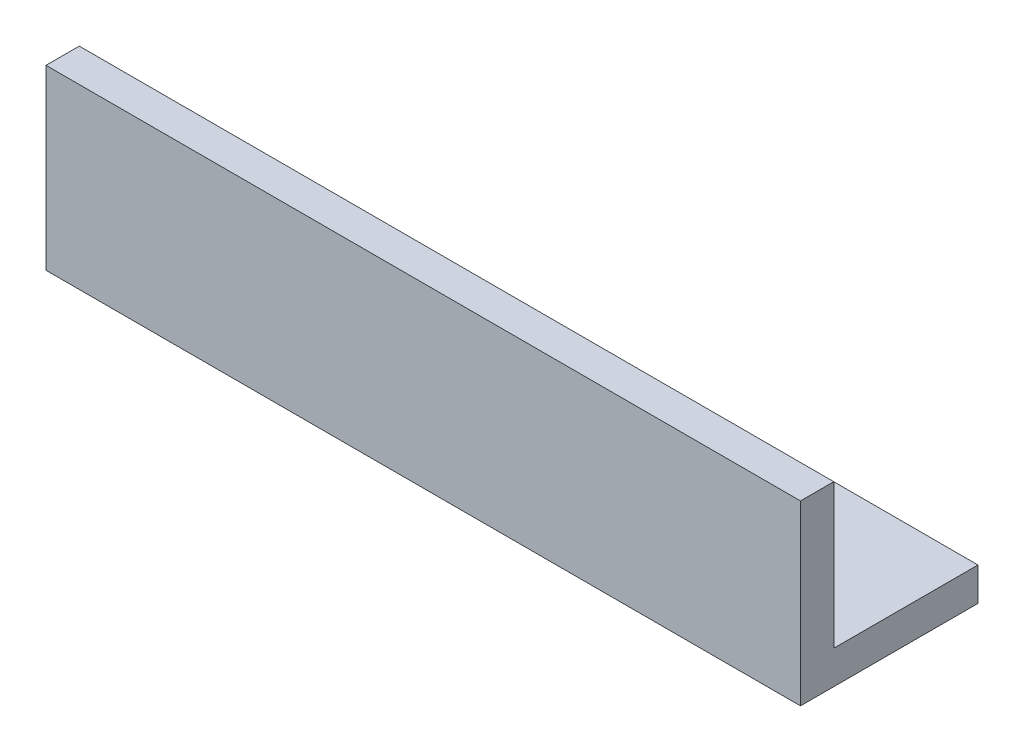
ISO-10303-21;
HEADER;
FILE_DESCRIPTION(('STEP AP214'),'2;1');
FILE_NAME('part.step','',(''),(''),'','','');
FILE_SCHEMA(('AUTOMOTIVE_DESIGN { 1 0 10303 214 1 1 1 1 }'));
ENDSEC;
DATA;
#1=APPLICATION_CONTEXT('core data for automotive mechanical design processes');
#2=APPLICATION_PROTOCOL_DEFINITION('international standard','automotive_design',2000,#1);
#3=PRODUCT_CONTEXT('',#1,'mechanical');
#4=PRODUCT('Part','Part','',(#3));
#5=PRODUCT_RELATED_PRODUCT_CATEGORY('part','',(#4));
#6=PRODUCT_DEFINITION_FORMATION('','',#4);
#7=PRODUCT_DEFINITION_CONTEXT('part definition',#1,'design');
#8=PRODUCT_DEFINITION('design','',#6,#7);
#9=PRODUCT_DEFINITION_SHAPE('','',#8);
#10=(LENGTH_UNIT() NAMED_UNIT(*) SI_UNIT(.MILLI.,.METRE.));
#11=(NAMED_UNIT(*) PLANE_ANGLE_UNIT() SI_UNIT($,.RADIAN.));
#12=(NAMED_UNIT(*) SI_UNIT($,.STERADIAN.) SOLID_ANGLE_UNIT());
#13=UNCERTAINTY_MEASURE_WITH_UNIT(LENGTH_MEASURE(1.E-05),#10,'distance_accuracy_value','');
#14=(GEOMETRIC_REPRESENTATION_CONTEXT(3) GLOBAL_UNCERTAINTY_ASSIGNED_CONTEXT((#13)) GLOBAL_UNIT_ASSIGNED_CONTEXT((#10,
#11,#12)) REPRESENTATION_CONTEXT('',''));
#15=CARTESIAN_POINT('',(0.,0.,0.));
#16=DIRECTION('',(0.,0.,1.));
#17=DIRECTION('',(1.,0.,0.));
#18=AXIS2_PLACEMENT_3D('',#15,#16,#17);
#19=CARTESIAN_POINT('',(107.95,0.,-4.7625));
#20=DIRECTION('',(0.,-1.,0.));
#21=DIRECTION('',(0.,0.,-1.));
#22=AXIS2_PLACEMENT_3D('',#19,#20,#21);
#23=PLANE('',#22);
#24=DIRECTION('',(0.,0.,1.));
#25=VECTOR('',#24,1.);
#26=CARTESIAN_POINT('',(0.,0.,-4.7625));
#27=LINE('',#26,#25);
#28=CARTESIAN_POINT('',(0.,0.,-4.7625));
#29=VERTEX_POINT('',#28);
#30=CARTESIAN_POINT('',(0.,0.,0.));
#31=VERTEX_POINT('',#30);
#32=EDGE_CURVE('E117',#29,#31,#27,.T.);
#33=ORIENTED_EDGE('',*,*,#32,.T.);
#34=DIRECTION('',(-1.,0.,0.));
#35=VECTOR('',#34,1.);
#36=CARTESIAN_POINT('',(107.95,0.,0.));
#37=LINE('',#36,#35);
#38=CARTESIAN_POINT('',(107.95,0.,0.));
#39=VERTEX_POINT('',#38);
#40=EDGE_CURVE('E11',#39,#31,#37,.T.);
#41=ORIENTED_EDGE('',*,*,#40,.F.);
#42=DIRECTION('',(0.,0.,1.));
#43=VECTOR('',#42,1.);
#44=CARTESIAN_POINT('',(107.95,0.,-4.7625));
#45=LINE('',#44,#43);
#46=CARTESIAN_POINT('',(107.95,0.,-4.7625));
#47=VERTEX_POINT('',#46);
#48=EDGE_CURVE('E128',#47,#39,#45,.T.);
#49=ORIENTED_EDGE('',*,*,#48,.F.);
#50=DIRECTION('',(-1.,0.,0.));
#51=VECTOR('',#50,1.);
#52=CARTESIAN_POINT('',(107.95,0.,-4.7625));
#53=LINE('',#52,#51);
#54=EDGE_CURVE('E113',#47,#29,#53,.T.);
#55=ORIENTED_EDGE('',*,*,#54,.T.);
#56=EDGE_LOOP('',(#33,#41,#49,#55));
#57=FACE_BOUND('',#56,.T.);
#58=ADVANCED_FACE('F33',(#57),#23,.F.);
#59=CARTESIAN_POINT('',(107.95,0.,0.));
#60=DIRECTION('',(0.,0.,-1.));
#61=DIRECTION('',(0.,1.,0.));
#62=AXIS2_PLACEMENT_3D('',#59,#60,#61);
#63=PLANE('',#62);
#64=DIRECTION('',(0.,-1.,0.));
#65=VECTOR('',#64,1.);
#66=CARTESIAN_POINT('',(0.,0.,0.));
#67=LINE('',#66,#65);
#68=CARTESIAN_POINT('',(0.,-25.4,0.));
#69=VERTEX_POINT('',#68);
#70=EDGE_CURVE('E120',#31,#69,#67,.T.);
#71=ORIENTED_EDGE('',*,*,#70,.T.);
#72=DIRECTION('',(-1.,0.,0.));
#73=VECTOR('',#72,1.);
#74=CARTESIAN_POINT('',(107.95,-25.4,0.));
#75=LINE('',#74,#73);
#76=CARTESIAN_POINT('',(107.95,-25.4,0.));
#77=VERTEX_POINT('',#76);
#78=EDGE_CURVE('E41',#77,#69,#75,.T.);
#79=ORIENTED_EDGE('',*,*,#78,.F.);
#80=DIRECTION('',(0.,-1.,0.));
#81=VECTOR('',#80,1.);
#82=CARTESIAN_POINT('',(107.95,0.,0.));
#83=LINE('',#82,#81);
#84=EDGE_CURVE('E86',#39,#77,#83,.T.);
#85=ORIENTED_EDGE('',*,*,#84,.F.);
#86=ORIENTED_EDGE('',*,*,#40,.T.);
#87=EDGE_LOOP('',(#71,#79,#85,#86));
#88=FACE_BOUND('',#87,.T.);
#89=ADVANCED_FACE('F153',(#88),#63,.F.);
#90=CARTESIAN_POINT('',(107.95,-25.4,0.));
#91=DIRECTION('',(0.,1.,0.));
#92=DIRECTION('',(0.,0.,1.));
#93=AXIS2_PLACEMENT_3D('',#90,#91,#92);
#94=PLANE('',#93);
#95=CARTESIAN_POINT('',(76.3321770290876,-25.4,-13.4703841816036));
#96=DIRECTION('',(0.,-1.,0.));
#97=DIRECTION('',(0.,0.,-1.));
#98=AXIS2_PLACEMENT_3D('',#95,#96,#97);
#99=CIRCLE('',#98,3.17499999999994);
#100=CARTESIAN_POINT('',(76.3321770290876,-25.4,-16.6453841816036));
#101=VERTEX_POINT('',#100);
#102=EDGE_CURVE('E246',#101,#101,#99,.T.);
#103=ORIENTED_EDGE('',*,*,#102,.F.);
#104=EDGE_LOOP('',(#103));
#105=FACE_BOUND('',#104,.T.);
#106=CARTESIAN_POINT('',(19.05,-25.4,-17.4625));
#107=DIRECTION('',(0.,1.,0.));
#108=DIRECTION('',(0.,0.,1.));
#109=AXIS2_PLACEMENT_3D('',#106,#107,#108);
#110=CIRCLE('',#109,3.175);
#111=CARTESIAN_POINT('',(19.05,-25.4,-14.2875));
#112=VERTEX_POINT('',#111);
#113=EDGE_CURVE('E233',#112,#112,#110,.F.);
#114=ORIENTED_EDGE('',*,*,#113,.F.);
#115=EDGE_LOOP('',(#114));
#116=FACE_BOUND('',#115,.T.);
#117=CARTESIAN_POINT('',(9.525,-25.4,-11.1125));
#118=DIRECTION('',(0.,1.,0.));
#119=DIRECTION('',(0.,0.,1.));
#120=AXIS2_PLACEMENT_3D('',#117,#118,#119);
#121=CIRCLE('',#120,3.175);
#122=CARTESIAN_POINT('',(9.525,-25.4,-7.9375));
#123=VERTEX_POINT('',#122);
#124=EDGE_CURVE('E121',#123,#123,#121,.F.);
#125=ORIENTED_EDGE('',*,*,#124,.F.);
#126=EDGE_LOOP('',(#125));
#127=FACE_BOUND('',#126,.T.);
#128=DIRECTION('',(0.,0.,-1.));
#129=VECTOR('',#128,1.);
#130=CARTESIAN_POINT('',(0.,-25.4,0.));
#131=LINE('',#130,#129);
#132=CARTESIAN_POINT('',(0.,-25.4,-25.4));
#133=VERTEX_POINT('',#132);
#134=EDGE_CURVE('E123',#69,#133,#131,.T.);
#135=ORIENTED_EDGE('',*,*,#134,.T.);
#136=DIRECTION('',(-1.,0.,0.));
#137=VECTOR('',#136,1.);
#138=CARTESIAN_POINT('',(107.95,-25.4,-25.4));
#139=LINE('',#138,#137);
#140=CARTESIAN_POINT('',(107.95,-25.4,-25.4));
#141=VERTEX_POINT('',#140);
#142=EDGE_CURVE('E108',#141,#133,#139,.T.);
#143=ORIENTED_EDGE('',*,*,#142,.F.);
#144=DIRECTION('',(0.,0.,-1.));
#145=VECTOR('',#144,1.);
#146=CARTESIAN_POINT('',(107.95,-25.4,0.));
#147=LINE('',#146,#145);
#148=EDGE_CURVE('E99',#77,#141,#147,.T.);
#149=ORIENTED_EDGE('',*,*,#148,.F.);
#150=ORIENTED_EDGE('',*,*,#78,.T.);
#151=EDGE_LOOP('',(#135,#143,#149,#150));
#152=FACE_BOUND('',#151,.T.);
#153=ADVANCED_FACE('F134',(#105,#116,#127,#152),#94,.F.);
#154=CARTESIAN_POINT('',(107.95,-25.4,-25.4));
#155=DIRECTION('',(0.,0.,1.));
#156=DIRECTION('',(1.,0.,0.));
#157=AXIS2_PLACEMENT_3D('',#154,#155,#156);
#158=PLANE('',#157);
#159=DIRECTION('',(0.,1.,0.));
#160=VECTOR('',#159,1.);
#161=CARTESIAN_POINT('',(0.,-25.4,-25.4));
#162=LINE('',#161,#160);
#163=CARTESIAN_POINT('',(0.,-20.6375,-25.4));
#164=VERTEX_POINT('',#163);
#165=EDGE_CURVE('E107',#133,#164,#162,.T.);
#166=ORIENTED_EDGE('',*,*,#165,.T.);
#167=DIRECTION('',(-1.,0.,0.));
#168=VECTOR('',#167,1.);
#169=CARTESIAN_POINT('',(107.95,-20.6375,-25.4));
#170=LINE('',#169,#168);
#171=CARTESIAN_POINT('',(107.95,-20.6375,-25.4));
#172=VERTEX_POINT('',#171);
#173=EDGE_CURVE('E104',#172,#164,#170,.T.);
#174=ORIENTED_EDGE('',*,*,#173,.F.);
#175=DIRECTION('',(0.,1.,0.));
#176=VECTOR('',#175,1.);
#177=CARTESIAN_POINT('',(107.95,-25.4,-25.4));
#178=LINE('',#177,#176);
#179=EDGE_CURVE('E93',#141,#172,#178,.T.);
#180=ORIENTED_EDGE('',*,*,#179,.F.);
#181=ORIENTED_EDGE('',*,*,#142,.T.);
#182=EDGE_LOOP('',(#166,#174,#180,#181));
#183=FACE_BOUND('',#182,.T.);
#184=ADVANCED_FACE('F105',(#183),#158,.F.);
#185=CARTESIAN_POINT('',(107.95,-20.6375,-25.4));
#186=DIRECTION('',(0.,-1.,0.));
#187=DIRECTION('',(0.,0.,-1.));
#188=AXIS2_PLACEMENT_3D('',#185,#186,#187);
#189=PLANE('',#188);
#190=CARTESIAN_POINT('',(76.3321770290876,-20.6375,-13.4703841816036));
#191=DIRECTION('',(0.,-1.,0.));
#192=DIRECTION('',(0.,0.,-1.));
#193=AXIS2_PLACEMENT_3D('',#190,#191,#192);
#194=CIRCLE('',#193,3.17499999999994);
#195=CARTESIAN_POINT('',(76.3321770290876,-20.6375,-16.6453841816036));
#196=VERTEX_POINT('',#195);
#197=EDGE_CURVE('E243',#196,#196,#194,.F.);
#198=ORIENTED_EDGE('',*,*,#197,.F.);
#199=EDGE_LOOP('',(#198));
#200=FACE_BOUND('',#199,.T.);
#201=CARTESIAN_POINT('',(19.05,-20.6375,-17.4625));
#202=DIRECTION('',(0.,1.,0.));
#203=DIRECTION('',(0.,0.,1.));
#204=AXIS2_PLACEMENT_3D('',#201,#202,#203);
#205=CIRCLE('',#204,3.175);
#206=CARTESIAN_POINT('',(19.05,-20.6375,-14.2875));
#207=VERTEX_POINT('',#206);
#208=EDGE_CURVE('E240',#207,#207,#205,.T.);
#209=ORIENTED_EDGE('',*,*,#208,.F.);
#210=EDGE_LOOP('',(#209));
#211=FACE_BOUND('',#210,.T.);
#212=CARTESIAN_POINT('',(9.525,-20.6375,-11.1125));
#213=DIRECTION('',(0.,1.,0.));
#214=DIRECTION('',(0.,0.,1.));
#215=AXIS2_PLACEMENT_3D('',#212,#213,#214);
#216=CIRCLE('',#215,3.175);
#217=CARTESIAN_POINT('',(9.525,-20.6375,-7.9375));
#218=VERTEX_POINT('',#217);
#219=EDGE_CURVE('E228',#218,#218,#216,.T.);
#220=ORIENTED_EDGE('',*,*,#219,.F.);
#221=EDGE_LOOP('',(#220));
#222=FACE_BOUND('',#221,.T.);
#223=DIRECTION('',(0.,0.,1.));
#224=VECTOR('',#223,1.);
#225=CARTESIAN_POINT('',(0.,-20.6375,-25.4));
#226=LINE('',#225,#224);
#227=CARTESIAN_POINT('',(0.,-20.6375,-4.7625));
#228=VERTEX_POINT('',#227);
#229=EDGE_CURVE('E72',#164,#228,#226,.T.);
#230=ORIENTED_EDGE('',*,*,#229,.T.);
#231=DIRECTION('',(-1.,0.,0.));
#232=VECTOR('',#231,1.);
#233=CARTESIAN_POINT('',(107.95,-20.6375,-4.7625));
#234=LINE('',#233,#232);
#235=CARTESIAN_POINT('',(107.95,-20.6375,-4.7625));
#236=VERTEX_POINT('',#235);
#237=EDGE_CURVE('E109',#236,#228,#234,.T.);
#238=ORIENTED_EDGE('',*,*,#237,.F.);
#239=DIRECTION('',(0.,0.,1.));
#240=VECTOR('',#239,1.);
#241=CARTESIAN_POINT('',(107.95,-20.6375,-25.4));
#242=LINE('',#241,#240);
#243=EDGE_CURVE('E97',#172,#236,#242,.T.);
#244=ORIENTED_EDGE('',*,*,#243,.F.);
#245=ORIENTED_EDGE('',*,*,#173,.T.);
#246=EDGE_LOOP('',(#230,#238,#244,#245));
#247=FACE_BOUND('',#246,.T.);
#248=ADVANCED_FACE('F111',(#200,#211,#222,#247),#189,.F.);
#249=CARTESIAN_POINT('',(107.95,-20.6375,-4.7625));
#250=DIRECTION('',(0.,0.,1.));
#251=DIRECTION('',(0.,-1.,0.));
#252=AXIS2_PLACEMENT_3D('',#249,#250,#251);
#253=PLANE('',#252);
#254=DIRECTION('',(0.,1.,0.));
#255=VECTOR('',#254,1.);
#256=CARTESIAN_POINT('',(0.,-20.6375,-4.7625));
#257=LINE('',#256,#255);
#258=EDGE_CURVE('E78',#228,#29,#257,.T.);
#259=ORIENTED_EDGE('',*,*,#258,.T.);
#260=ORIENTED_EDGE('',*,*,#54,.F.);
#261=DIRECTION('',(0.,1.,0.));
#262=VECTOR('',#261,1.);
#263=CARTESIAN_POINT('',(107.95,-20.6375,-4.7625));
#264=LINE('',#263,#262);
#265=EDGE_CURVE('E49',#236,#47,#264,.T.);
#266=ORIENTED_EDGE('',*,*,#265,.F.);
#267=ORIENTED_EDGE('',*,*,#237,.T.);
#268=EDGE_LOOP('',(#259,#260,#266,#267));
#269=FACE_BOUND('',#268,.T.);
#270=ADVANCED_FACE('F141',(#269),#253,.F.);
#271=CARTESIAN_POINT('',(107.95,0.,0.));
#272=DIRECTION('',(1.,0.,0.));
#273=DIRECTION('',(0.,0.,-1.));
#274=AXIS2_PLACEMENT_3D('',#271,#272,#273);
#275=PLANE('',#274);
#276=ORIENTED_EDGE('',*,*,#48,.T.);
#277=ORIENTED_EDGE('',*,*,#84,.T.);
#278=ORIENTED_EDGE('',*,*,#148,.T.);
#279=ORIENTED_EDGE('',*,*,#179,.T.);
#280=ORIENTED_EDGE('',*,*,#243,.T.);
#281=ORIENTED_EDGE('',*,*,#265,.T.);
#282=EDGE_LOOP('',(#276,#277,#278,#279,#280,#281));
#283=FACE_BOUND('',#282,.T.);
#284=ADVANCED_FACE('F95',(#283),#275,.T.);
#285=CARTESIAN_POINT('',(0.,0.,0.));
#286=DIRECTION('',(1.,0.,0.));
#287=DIRECTION('',(0.,0.,-1.));
#288=AXIS2_PLACEMENT_3D('',#285,#286,#287);
#289=PLANE('',#288);
#290=ORIENTED_EDGE('',*,*,#32,.F.);
#291=ORIENTED_EDGE('',*,*,#258,.F.);
#292=ORIENTED_EDGE('',*,*,#229,.F.);
#293=ORIENTED_EDGE('',*,*,#165,.F.);
#294=ORIENTED_EDGE('',*,*,#134,.F.);
#295=ORIENTED_EDGE('',*,*,#70,.F.);
#296=EDGE_LOOP('',(#290,#291,#292,#293,#294,#295));
#297=FACE_BOUND('',#296,.T.);
#298=ADVANCED_FACE('F137',(#297),#289,.F.);
#299=CARTESIAN_POINT('',(9.525,-25.401,-11.1125));
#300=DIRECTION('',(0.,1.,0.));
#301=DIRECTION('',(0.,0.,1.));
#302=AXIS2_PLACEMENT_3D('',#299,#300,#301);
#303=CYLINDRICAL_SURFACE('',#302,3.175);
#304=ORIENTED_EDGE('',*,*,#219,.T.);
#305=EDGE_LOOP('',(#304));
#306=FACE_BOUND('',#305,.T.);
#307=ORIENTED_EDGE('',*,*,#124,.T.);
#308=EDGE_LOOP('',(#307));
#309=FACE_BOUND('',#308,.T.);
#310=ADVANCED_FACE('F195',(#306,#309),#303,.F.);
#311=CARTESIAN_POINT('',(19.05,-25.401,-17.4625));
#312=DIRECTION('',(0.,1.,0.));
#313=DIRECTION('',(0.,0.,1.));
#314=AXIS2_PLACEMENT_3D('',#311,#312,#313);
#315=CYLINDRICAL_SURFACE('',#314,3.175);
#316=ORIENTED_EDGE('',*,*,#208,.T.);
#317=EDGE_LOOP('',(#316));
#318=FACE_BOUND('',#317,.T.);
#319=ORIENTED_EDGE('',*,*,#113,.T.);
#320=EDGE_LOOP('',(#319));
#321=FACE_BOUND('',#320,.T.);
#322=ADVANCED_FACE('F185',(#318,#321),#315,.F.);
#323=CARTESIAN_POINT('',(76.3321770290876,0.001000000000001,-13.4703841816036));
#324=DIRECTION('',(0.,-1.,0.));
#325=DIRECTION('',(0.,0.,-1.));
#326=AXIS2_PLACEMENT_3D('',#323,#324,#325);
#327=CYLINDRICAL_SURFACE('',#326,3.17499999999994);
#328=CARTESIAN_POINT('',(76.3321770290876,-25.4,-16.6453841816036));
#329=CARTESIAN_POINT('',(76.3321770290876,-25.350390625,-16.6453841816036));
#330=CARTESIAN_POINT('',(76.3321770290876,-25.30078125,-16.6453841816036));
#331=CARTESIAN_POINT('',(76.3321770290876,-25.2015625,-16.6453841816036));
#332=CARTESIAN_POINT('',(76.3321770290876,-25.151953125,-16.6453841816036));
#333=CARTESIAN_POINT('',(76.3321770290876,-25.052734375,-16.6453841816036));
#334=CARTESIAN_POINT('',(76.3321770290876,-25.003125,-16.6453841816036));
#335=CARTESIAN_POINT('',(76.3321770290876,-24.90390625,-16.6453841816036));
#336=CARTESIAN_POINT('',(76.3321770290876,-24.854296875,-16.6453841816036));
#337=CARTESIAN_POINT('',(76.3321770290876,-24.755078125,-16.6453841816036));
#338=CARTESIAN_POINT('',(76.3321770290876,-24.70546875,-16.6453841816036));
#339=CARTESIAN_POINT('',(76.3321770290876,-24.60625,-16.6453841816036));
#340=CARTESIAN_POINT('',(76.3321770290876,-24.556640625,-16.6453841816036));
#341=CARTESIAN_POINT('',(76.3321770290876,-24.457421875,-16.6453841816036));
#342=CARTESIAN_POINT('',(76.3321770290876,-24.4078125,-16.6453841816036));
#343=CARTESIAN_POINT('',(76.3321770290876,-24.30859375,-16.6453841816036));
#344=CARTESIAN_POINT('',(76.3321770290876,-24.258984375,-16.6453841816036));
#345=CARTESIAN_POINT('',(76.3321770290876,-24.159765625,-16.6453841816036));
#346=CARTESIAN_POINT('',(76.3321770290876,-24.11015625,-16.6453841816036));
#347=CARTESIAN_POINT('',(76.3321770290876,-24.0109375,-16.6453841816036));
#348=CARTESIAN_POINT('',(76.3321770290876,-23.961328125,-16.6453841816036));
#349=CARTESIAN_POINT('',(76.3321770290876,-23.862109375,-16.6453841816036));
#350=CARTESIAN_POINT('',(76.3321770290876,-23.8125,-16.6453841816036));
#351=CARTESIAN_POINT('',(76.3321770290876,-23.71328125,-16.6453841816036));
#352=CARTESIAN_POINT('',(76.3321770290876,-23.663671875,-16.6453841816036));
#353=CARTESIAN_POINT('',(76.3321770290876,-23.564453125,-16.6453841816036));
#354=CARTESIAN_POINT('',(76.3321770290876,-23.51484375,-16.6453841816036));
#355=CARTESIAN_POINT('',(76.3321770290876,-23.415625,-16.6453841816036));
#356=CARTESIAN_POINT('',(76.3321770290876,-23.366015625,-16.6453841816036));
#357=CARTESIAN_POINT('',(76.3321770290876,-23.266796875,-16.6453841816036));
#358=CARTESIAN_POINT('',(76.3321770290876,-23.2171875,-16.6453841816036));
#359=CARTESIAN_POINT('',(76.3321770290876,-23.11796875,-16.6453841816036));
#360=CARTESIAN_POINT('',(76.3321770290876,-23.068359375,-16.6453841816036));
#361=CARTESIAN_POINT('',(76.3321770290876,-22.969140625,-16.6453841816036));
#362=CARTESIAN_POINT('',(76.3321770290876,-22.91953125,-16.6453841816036));
#363=CARTESIAN_POINT('',(76.3321770290876,-22.8203125,-16.6453841816036));
#364=CARTESIAN_POINT('',(76.3321770290876,-22.770703125,-16.6453841816036));
#365=CARTESIAN_POINT('',(76.3321770290876,-22.671484375,-16.6453841816036));
#366=CARTESIAN_POINT('',(76.3321770290876,-22.621875,-16.6453841816036));
#367=CARTESIAN_POINT('',(76.3321770290876,-22.52265625,-16.6453841816036));
#368=CARTESIAN_POINT('',(76.3321770290876,-22.473046875,-16.6453841816036));
#369=CARTESIAN_POINT('',(76.3321770290876,-22.373828125,-16.6453841816036));
#370=CARTESIAN_POINT('',(76.3321770290876,-22.32421875,-16.6453841816036));
#371=CARTESIAN_POINT('',(76.3321770290876,-22.225,-16.6453841816036));
#372=CARTESIAN_POINT('',(76.3321770290876,-22.175390625,-16.6453841816036));
#373=CARTESIAN_POINT('',(76.3321770290876,-22.076171875,-16.6453841816036));
#374=CARTESIAN_POINT('',(76.3321770290876,-22.0265625,-16.6453841816036));
#375=CARTESIAN_POINT('',(76.3321770290876,-21.92734375,-16.6453841816036));
#376=CARTESIAN_POINT('',(76.3321770290876,-21.877734375,-16.6453841816036));
#377=CARTESIAN_POINT('',(76.3321770290876,-21.778515625,-16.6453841816036));
#378=CARTESIAN_POINT('',(76.3321770290876,-21.72890625,-16.6453841816036));
#379=CARTESIAN_POINT('',(76.3321770290876,-21.6296875,-16.6453841816036));
#380=CARTESIAN_POINT('',(76.3321770290876,-21.580078125,-16.6453841816036));
#381=CARTESIAN_POINT('',(76.3321770290876,-21.480859375,-16.6453841816036));
#382=CARTESIAN_POINT('',(76.3321770290876,-21.43125,-16.6453841816036));
#383=CARTESIAN_POINT('',(76.3321770290876,-21.33203125,-16.6453841816036));
#384=CARTESIAN_POINT('',(76.3321770290876,-21.282421875,-16.6453841816036));
#385=CARTESIAN_POINT('',(76.3321770290876,-21.183203125,-16.6453841816036));
#386=CARTESIAN_POINT('',(76.3321770290876,-21.13359375,-16.6453841816036));
#387=CARTESIAN_POINT('',(76.3321770290876,-21.034375,-16.6453841816036));
#388=CARTESIAN_POINT('',(76.3321770290876,-20.984765625,-16.6453841816036));
#389=CARTESIAN_POINT('',(76.3321770290876,-20.885546875,-16.6453841816036));
#390=CARTESIAN_POINT('',(76.3321770290876,-20.8359375,-16.6453841816036));
#391=CARTESIAN_POINT('',(76.3321770290876,-20.73671875,-16.6453841816036));
#392=CARTESIAN_POINT('',(76.3321770290876,-20.687109375,-16.6453841816036));
#393=CARTESIAN_POINT('',(76.3321770290876,-20.6375,-16.6453841816036));
#394=B_SPLINE_CURVE_WITH_KNOTS('',3,(#328,#329,#330,#331,#332,#333,#334,#335,#336,#337,#338,
#339,#340,#341,#342,#343,#344,#345,#346,#347,#348,#349,#350,#351,#352,#353,#354,#355,#356,#357,
#358,#359,#360,#361,#362,#363,#364,#365,#366,#367,#368,#369,#370,#371,#372,#373,#374,#375,#376,
#377,#378,#379,#380,#381,#382,#383,#384,#385,#386,#387,#388,#389,#390,#391,#392,#393),
.UNSPECIFIED.,.F.,.F.,(4,2,2,2,2,2,2,2,2,2,2,2,2,2,2,2,2,2,2,2,2,2,2,2,2,2,2,2,2,2,2,2,4),(0.,
0.148828125,0.29765625,0.446484375,0.5953125,0.744140625,0.892968750000001,1.041796875,1.190625,
1.339453125,1.48828125,1.637109375,1.7859375,1.934765625,2.08359375,2.232421875,2.38125,
2.530078125,2.67890625,2.827734375,2.9765625,3.125390625,3.27421875,3.42304687499999,3.571875,
3.720703125,3.86953125,4.018359375,4.1671875,4.316015625,4.46484375,4.613671875,4.7625),.UNSPECIFIED.);
#395=EDGE_CURVE('BSEAM181',#101,#196,#394,.T.);
#396=ORIENTED_EDGE('',*,*,#102,.T.);
#397=ORIENTED_EDGE('',*,*,#197,.T.);
#398=ORIENTED_EDGE('',*,*,#395,.T.);
#399=ORIENTED_EDGE('',*,*,#395,.F.);
#400=EDGE_LOOP('',(#396,#398,#397,#399));
#401=FACE_BOUND('',#400,.T.);
#402=ADVANCED_FACE('F181',(#401),#327,.F.);
#403=CLOSED_SHELL('',(#58,#89,#153,#184,#248,#270,#284,#298,#310,#322,#402));
#404=MANIFOLD_SOLID_BREP('B2',#403);
#405=ADVANCED_BREP_SHAPE_REPRESENTATION('',(#18,#404),#14);
#406=SHAPE_DEFINITION_REPRESENTATION(#9,#405);
ENDSEC;
END-ISO-10303-21;
